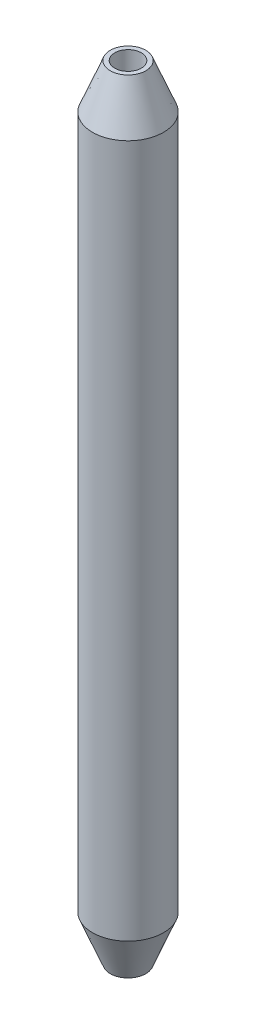
ISO-10303-21;
HEADER;
FILE_DESCRIPTION(('STEP AP214'),'2;1');
FILE_NAME('part.step','',(''),(''),'','','');
FILE_SCHEMA(('AUTOMOTIVE_DESIGN { 1 0 10303 214 1 1 1 1 }'));
ENDSEC;
DATA;
#1=APPLICATION_CONTEXT('core data for automotive mechanical design processes');
#2=APPLICATION_PROTOCOL_DEFINITION('international standard','automotive_design',2000,#1);
#3=PRODUCT_CONTEXT('',#1,'mechanical');
#4=PRODUCT('Part','Part','',(#3));
#5=PRODUCT_RELATED_PRODUCT_CATEGORY('part','',(#4));
#6=PRODUCT_DEFINITION_FORMATION('','',#4);
#7=PRODUCT_DEFINITION_CONTEXT('part definition',#1,'design');
#8=PRODUCT_DEFINITION('design','',#6,#7);
#9=PRODUCT_DEFINITION_SHAPE('','',#8);
#10=(LENGTH_UNIT() NAMED_UNIT(*) SI_UNIT(.MILLI.,.METRE.));
#11=(NAMED_UNIT(*) PLANE_ANGLE_UNIT() SI_UNIT($,.RADIAN.));
#12=(NAMED_UNIT(*) SI_UNIT($,.STERADIAN.) SOLID_ANGLE_UNIT());
#13=UNCERTAINTY_MEASURE_WITH_UNIT(LENGTH_MEASURE(1.E-05),#10,'distance_accuracy_value','');
#14=(GEOMETRIC_REPRESENTATION_CONTEXT(3) GLOBAL_UNCERTAINTY_ASSIGNED_CONTEXT((#13)) GLOBAL_UNIT_ASSIGNED_CONTEXT((#10,
#11,#12)) REPRESENTATION_CONTEXT('',''));
#15=CARTESIAN_POINT('',(0.,0.,0.));
#16=DIRECTION('',(0.,0.,1.));
#17=DIRECTION('',(1.,0.,0.));
#18=AXIS2_PLACEMENT_3D('',#15,#16,#17);
#19=CARTESIAN_POINT('',(0.,-39.,0.));
#20=DIRECTION('',(0.,1.,0.));
#21=DIRECTION('',(0.,0.,1.));
#22=AXIS2_PLACEMENT_3D('',#19,#20,#21);
#23=CONICAL_SURFACE('',#22,4.,0.380506377112365);
#24=CARTESIAN_POINT('',(0.,-44.,0.));
#25=DIRECTION('',(0.,-1.,0.));
#26=DIRECTION('',(0.,0.,-1.));
#27=AXIS2_PLACEMENT_3D('',#24,#25,#26);
#28=CIRCLE('',#27,2.);
#29=CARTESIAN_POINT('',(0.,-44.,-2.));
#30=VERTEX_POINT('',#29);
#31=EDGE_CURVE('E10',#30,#30,#28,.T.);
#32=ORIENTED_EDGE('',*,*,#31,.F.);
#33=EDGE_LOOP('',(#32));
#34=FACE_BOUND('',#33,.T.);
#35=CARTESIAN_POINT('',(0.,-39.,0.));
#36=DIRECTION('',(0.,-1.,0.));
#37=DIRECTION('',(0.,0.,-1.));
#38=AXIS2_PLACEMENT_3D('',#35,#36,#37);
#39=CIRCLE('',#38,4.);
#40=CARTESIAN_POINT('',(0.,-39.,-4.));
#41=VERTEX_POINT('',#40);
#42=EDGE_CURVE('E62',#41,#41,#39,.T.);
#43=ORIENTED_EDGE('',*,*,#42,.T.);
#44=EDGE_LOOP('',(#43));
#45=FACE_BOUND('',#44,.T.);
#46=ADVANCED_FACE('F39',(#34,#45),#23,.T.);
#47=CARTESIAN_POINT('',(0.,-44.,2.));
#48=DIRECTION('',(0.,1.,0.));
#49=DIRECTION('',(0.,0.,1.));
#50=AXIS2_PLACEMENT_3D('',#47,#48,#49);
#51=PLANE('',#50);
#52=CARTESIAN_POINT('',(0.,-44.,0.));
#53=DIRECTION('',(0.,-1.,0.));
#54=DIRECTION('',(0.,0.,-1.));
#55=AXIS2_PLACEMENT_3D('',#52,#53,#54);
#56=CIRCLE('',#55,1.49999999999999);
#57=CARTESIAN_POINT('',(0.,-44.,-1.49999999999999));
#58=VERTEX_POINT('',#57);
#59=EDGE_CURVE('E44',#58,#58,#56,.T.);
#60=ORIENTED_EDGE('',*,*,#59,.F.);
#61=EDGE_LOOP('',(#60));
#62=FACE_BOUND('',#61,.T.);
#63=ORIENTED_EDGE('',*,*,#31,.T.);
#64=EDGE_LOOP('',(#63));
#65=FACE_BOUND('',#64,.T.);
#66=ADVANCED_FACE('F86',(#62,#65),#51,.F.);
#67=CARTESIAN_POINT('',(0.,-38.9543998418034,0.));
#68=DIRECTION('',(0.,-1.,0.));
#69=DIRECTION('',(0.,0.,-1.));
#70=AXIS2_PLACEMENT_3D('',#67,#68,#69);
#71=CYLINDRICAL_SURFACE('',#70,1.49999999999999);
#72=CARTESIAN_POINT('',(0.,44.,0.));
#73=DIRECTION('',(0.,-1.,0.));
#74=DIRECTION('',(0.,0.,-1.));
#75=AXIS2_PLACEMENT_3D('',#72,#73,#74);
#76=CIRCLE('',#75,1.5);
#77=CARTESIAN_POINT('',(0.,44.,-1.5));
#78=VERTEX_POINT('',#77);
#79=EDGE_CURVE('E47',#78,#78,#76,.T.);
#80=ORIENTED_EDGE('',*,*,#79,.F.);
#81=EDGE_LOOP('',(#80));
#82=FACE_BOUND('',#81,.T.);
#83=ORIENTED_EDGE('',*,*,#59,.T.);
#84=EDGE_LOOP('',(#83));
#85=FACE_BOUND('',#84,.T.);
#86=ADVANCED_FACE('F83',(#82,#85),#71,.F.);
#87=CARTESIAN_POINT('',(0.,44.,2.00000000000001));
#88=DIRECTION('',(0.,-1.,0.));
#89=DIRECTION('',(0.,0.,-1.));
#90=AXIS2_PLACEMENT_3D('',#87,#88,#89);
#91=PLANE('',#90);
#92=CARTESIAN_POINT('',(0.,44.,0.));
#93=DIRECTION('',(0.,-1.,0.));
#94=DIRECTION('',(0.,0.,-1.));
#95=AXIS2_PLACEMENT_3D('',#92,#93,#94);
#96=CIRCLE('',#95,2.00000000000001);
#97=CARTESIAN_POINT('',(0.,44.,-2.00000000000001));
#98=VERTEX_POINT('',#97);
#99=EDGE_CURVE('E52',#98,#98,#96,.T.);
#100=ORIENTED_EDGE('',*,*,#99,.F.);
#101=EDGE_LOOP('',(#100));
#102=FACE_BOUND('',#101,.T.);
#103=ORIENTED_EDGE('',*,*,#79,.T.);
#104=EDGE_LOOP('',(#103));
#105=FACE_BOUND('',#104,.T.);
#106=ADVANCED_FACE('F75',(#102,#105),#91,.F.);
#107=CARTESIAN_POINT('',(0.,44.,0.));
#108=DIRECTION('',(0.,-1.,0.));
#109=DIRECTION('',(0.,0.,-1.));
#110=AXIS2_PLACEMENT_3D('',#107,#108,#109);
#111=CONICAL_SURFACE('',#110,2.00000000000001,0.380506377112365);
#112=CARTESIAN_POINT('',(0.,39.,0.));
#113=DIRECTION('',(0.,-1.,0.));
#114=DIRECTION('',(0.,0.,-1.));
#115=AXIS2_PLACEMENT_3D('',#112,#113,#114);
#116=CIRCLE('',#115,4.00000000000001);
#117=CARTESIAN_POINT('',(0.,39.,-4.00000000000001));
#118=VERTEX_POINT('',#117);
#119=EDGE_CURVE('E59',#118,#118,#116,.T.);
#120=ORIENTED_EDGE('',*,*,#119,.F.);
#121=EDGE_LOOP('',(#120));
#122=FACE_BOUND('',#121,.T.);
#123=ORIENTED_EDGE('',*,*,#99,.T.);
#124=EDGE_LOOP('',(#123));
#125=FACE_BOUND('',#124,.T.);
#126=ADVANCED_FACE('F69',(#122,#125),#111,.T.);
#127=CARTESIAN_POINT('',(0.,-38.9543998418034,0.));
#128=DIRECTION('',(0.,-1.,0.));
#129=DIRECTION('',(0.,0.,-1.));
#130=AXIS2_PLACEMENT_3D('',#127,#128,#129);
#131=CYLINDRICAL_SURFACE('',#130,4.);
#132=ORIENTED_EDGE('',*,*,#42,.F.);
#133=EDGE_LOOP('',(#132));
#134=FACE_BOUND('',#133,.T.);
#135=ORIENTED_EDGE('',*,*,#119,.T.);
#136=EDGE_LOOP('',(#135));
#137=FACE_BOUND('',#136,.T.);
#138=ADVANCED_FACE('F67',(#134,#137),#131,.T.);
#139=CLOSED_SHELL('',(#46,#66,#86,#106,#126,#138));
#140=MANIFOLD_SOLID_BREP('B2',#139);
#141=ADVANCED_BREP_SHAPE_REPRESENTATION('',(#18,#140),#14);
#142=SHAPE_DEFINITION_REPRESENTATION(#9,#141);
ENDSEC;
END-ISO-10303-21;
